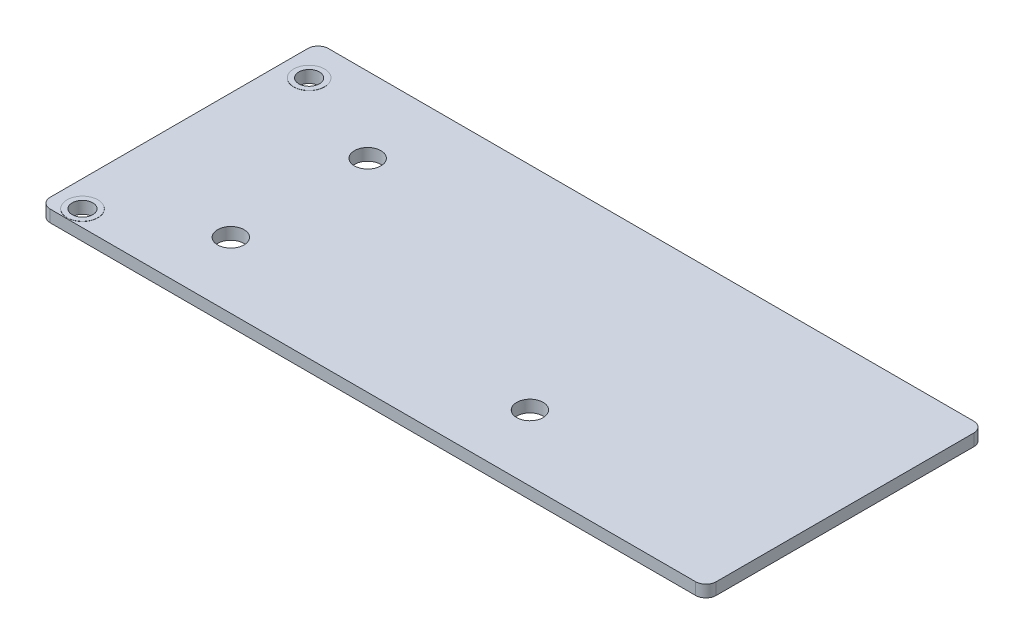
ISO-10303-21;
HEADER;
FILE_DESCRIPTION(('STEP AP214'),'2;1');
FILE_NAME('part.step','',(''),(''),'','','');
FILE_SCHEMA(('AUTOMOTIVE_DESIGN { 1 0 10303 214 1 1 1 1 }'));
ENDSEC;
DATA;
#1=APPLICATION_CONTEXT('core data for automotive mechanical design processes');
#2=APPLICATION_PROTOCOL_DEFINITION('international standard','automotive_design',2000,#1);
#3=PRODUCT_CONTEXT('',#1,'mechanical');
#4=PRODUCT('Part','Part','',(#3));
#5=PRODUCT_RELATED_PRODUCT_CATEGORY('part','',(#4));
#6=PRODUCT_DEFINITION_FORMATION('','',#4);
#7=PRODUCT_DEFINITION_CONTEXT('part definition',#1,'design');
#8=PRODUCT_DEFINITION('design','',#6,#7);
#9=PRODUCT_DEFINITION_SHAPE('','',#8);
#10=(LENGTH_UNIT() NAMED_UNIT(*) SI_UNIT(.MILLI.,.METRE.));
#11=(NAMED_UNIT(*) PLANE_ANGLE_UNIT() SI_UNIT($,.RADIAN.));
#12=(NAMED_UNIT(*) SI_UNIT($,.STERADIAN.) SOLID_ANGLE_UNIT());
#13=UNCERTAINTY_MEASURE_WITH_UNIT(LENGTH_MEASURE(1.E-05),#10,'distance_accuracy_value','');
#14=(GEOMETRIC_REPRESENTATION_CONTEXT(3) GLOBAL_UNCERTAINTY_ASSIGNED_CONTEXT((#13)) GLOBAL_UNIT_ASSIGNED_CONTEXT((#10,
#11,#12)) REPRESENTATION_CONTEXT('',''));
#15=CARTESIAN_POINT('',(0.,0.,0.));
#16=DIRECTION('',(0.,0.,1.));
#17=DIRECTION('',(1.,0.,0.));
#18=AXIS2_PLACEMENT_3D('',#15,#16,#17);
#19=CARTESIAN_POINT('',(32.325,1.16,13.5));
#20=DIRECTION('',(-1.,0.,0.));
#21=DIRECTION('',(0.,0.,1.));
#22=AXIS2_PLACEMENT_3D('',#19,#20,#21);
#23=PLANE('',#22);
#24=DIRECTION('',(0.,0.,-1.));
#25=VECTOR('',#24,1.);
#26=CARTESIAN_POINT('',(32.325,0.,13.5));
#27=LINE('',#26,#25);
#28=CARTESIAN_POINT('',(32.325,0.,12.5));
#29=VERTEX_POINT('',#28);
#30=CARTESIAN_POINT('',(32.325,0.,-12.5));
#31=VERTEX_POINT('',#30);
#32=EDGE_CURVE('E135',#29,#31,#27,.T.);
#33=ORIENTED_EDGE('',*,*,#32,.T.);
#34=DIRECTION('',(0.,-1.,0.));
#35=VECTOR('',#34,1.);
#36=CARTESIAN_POINT('',(32.325,1.16,-12.5));
#37=LINE('',#36,#35);
#38=CARTESIAN_POINT('',(32.325,1.16,-12.5));
#39=VERTEX_POINT('',#38);
#40=EDGE_CURVE('E158',#31,#39,#37,.F.);
#41=ORIENTED_EDGE('',*,*,#40,.T.);
#42=DIRECTION('',(0.,0.,-1.));
#43=VECTOR('',#42,1.);
#44=CARTESIAN_POINT('',(32.325,1.16,13.5));
#45=LINE('',#44,#43);
#46=CARTESIAN_POINT('',(32.325,1.16,12.5));
#47=VERTEX_POINT('',#46);
#48=EDGE_CURVE('E133',#47,#39,#45,.T.);
#49=ORIENTED_EDGE('',*,*,#48,.F.);
#50=DIRECTION('',(0.,-1.,0.));
#51=VECTOR('',#50,1.);
#52=CARTESIAN_POINT('',(32.325,1.16,12.5));
#53=LINE('',#52,#51);
#54=EDGE_CURVE('E155',#47,#29,#53,.T.);
#55=ORIENTED_EDGE('',*,*,#54,.T.);
#56=EDGE_LOOP('',(#33,#41,#49,#55));
#57=FACE_BOUND('',#56,.T.);
#58=ADVANCED_FACE('F38',(#57),#23,.F.);
#59=CARTESIAN_POINT('',(-32.325,1.16,-13.5));
#60=DIRECTION('',(0.,0.,1.));
#61=DIRECTION('',(1.,0.,0.));
#62=AXIS2_PLACEMENT_3D('',#59,#60,#61);
#63=PLANE('',#62);
#64=DIRECTION('',(-1.,0.,0.));
#65=VECTOR('',#64,1.);
#66=CARTESIAN_POINT('',(-32.325,0.,-13.5));
#67=LINE('',#66,#65);
#68=CARTESIAN_POINT('',(31.325,0.,-13.5));
#69=VERTEX_POINT('',#68);
#70=CARTESIAN_POINT('',(-31.325,0.,-13.5));
#71=VERTEX_POINT('',#70);
#72=EDGE_CURVE('E131',#69,#71,#67,.T.);
#73=ORIENTED_EDGE('',*,*,#72,.T.);
#74=DIRECTION('',(0.,-1.,0.));
#75=VECTOR('',#74,1.);
#76=CARTESIAN_POINT('',(-31.325,1.16,-13.5));
#77=LINE('',#76,#75);
#78=CARTESIAN_POINT('',(-31.325,1.16,-13.5));
#79=VERTEX_POINT('',#78);
#80=EDGE_CURVE('E110',#71,#79,#77,.F.);
#81=ORIENTED_EDGE('',*,*,#80,.T.);
#82=DIRECTION('',(-1.,0.,0.));
#83=VECTOR('',#82,1.);
#84=CARTESIAN_POINT('',(-32.325,1.16,-13.5));
#85=LINE('',#84,#83);
#86=CARTESIAN_POINT('',(31.325,1.16,-13.5));
#87=VERTEX_POINT('',#86);
#88=EDGE_CURVE('E197',#87,#79,#85,.T.);
#89=ORIENTED_EDGE('',*,*,#88,.F.);
#90=DIRECTION('',(0.,-1.,0.));
#91=VECTOR('',#90,1.);
#92=CARTESIAN_POINT('',(31.325,1.16,-13.5));
#93=LINE('',#92,#91);
#94=EDGE_CURVE('E115',#87,#69,#93,.T.);
#95=ORIENTED_EDGE('',*,*,#94,.T.);
#96=EDGE_LOOP('',(#73,#81,#89,#95));
#97=FACE_BOUND('',#96,.T.);
#98=ADVANCED_FACE('F216',(#97),#63,.F.);
#99=CARTESIAN_POINT('',(-32.325,1.16,13.5));
#100=DIRECTION('',(1.,0.,0.));
#101=DIRECTION('',(0.,0.,-1.));
#102=AXIS2_PLACEMENT_3D('',#99,#100,#101);
#103=PLANE('',#102);
#104=DIRECTION('',(0.,0.,1.));
#105=VECTOR('',#104,1.);
#106=CARTESIAN_POINT('',(-32.325,1.16,13.5));
#107=LINE('',#106,#105);
#108=CARTESIAN_POINT('',(-32.325,1.16,-12.5));
#109=VERTEX_POINT('',#108);
#110=CARTESIAN_POINT('',(-32.325,1.16,12.5));
#111=VERTEX_POINT('',#110);
#112=EDGE_CURVE('E124',#109,#111,#107,.T.);
#113=ORIENTED_EDGE('',*,*,#112,.F.);
#114=DIRECTION('',(0.,-1.,0.));
#115=VECTOR('',#114,1.);
#116=CARTESIAN_POINT('',(-32.325,1.16,-12.5));
#117=LINE('',#116,#115);
#118=CARTESIAN_POINT('',(-32.325,0.,-12.5));
#119=VERTEX_POINT('',#118);
#120=EDGE_CURVE('E109',#109,#119,#117,.T.);
#121=ORIENTED_EDGE('',*,*,#120,.T.);
#122=DIRECTION('',(0.,0.,1.));
#123=VECTOR('',#122,1.);
#124=CARTESIAN_POINT('',(-32.325,0.,13.5));
#125=LINE('',#124,#123);
#126=CARTESIAN_POINT('',(-32.325,0.,12.5));
#127=VERTEX_POINT('',#126);
#128=EDGE_CURVE('E122',#119,#127,#125,.T.);
#129=ORIENTED_EDGE('',*,*,#128,.T.);
#130=DIRECTION('',(0.,-1.,0.));
#131=VECTOR('',#130,1.);
#132=CARTESIAN_POINT('',(-32.325,1.16,12.5));
#133=LINE('',#132,#131);
#134=EDGE_CURVE('E126',#127,#111,#133,.F.);
#135=ORIENTED_EDGE('',*,*,#134,.T.);
#136=EDGE_LOOP('',(#113,#121,#129,#135));
#137=FACE_BOUND('',#136,.T.);
#138=ADVANCED_FACE('F121',(#137),#103,.F.);
#139=CARTESIAN_POINT('',(-32.325,1.16,13.5));
#140=DIRECTION('',(0.,0.,-1.));
#141=DIRECTION('',(-1.,0.,0.));
#142=AXIS2_PLACEMENT_3D('',#139,#140,#141);
#143=PLANE('',#142);
#144=DIRECTION('',(1.,0.,0.));
#145=VECTOR('',#144,1.);
#146=CARTESIAN_POINT('',(-32.325,0.,13.5));
#147=LINE('',#146,#145);
#148=CARTESIAN_POINT('',(-31.325,0.,13.5));
#149=VERTEX_POINT('',#148);
#150=CARTESIAN_POINT('',(31.325,0.,13.5));
#151=VERTEX_POINT('',#150);
#152=EDGE_CURVE('E130',#149,#151,#147,.T.);
#153=ORIENTED_EDGE('',*,*,#152,.T.);
#154=DIRECTION('',(0.,-1.,0.));
#155=VECTOR('',#154,1.);
#156=CARTESIAN_POINT('',(31.325,1.16,13.5));
#157=LINE('',#156,#155);
#158=CARTESIAN_POINT('',(31.325,1.16,13.5));
#159=VERTEX_POINT('',#158);
#160=EDGE_CURVE('E53',#151,#159,#157,.F.);
#161=ORIENTED_EDGE('',*,*,#160,.T.);
#162=DIRECTION('',(1.,0.,0.));
#163=VECTOR('',#162,1.);
#164=CARTESIAN_POINT('',(-32.325,1.16,13.5));
#165=LINE('',#164,#163);
#166=CARTESIAN_POINT('',(-31.325,1.16,13.5));
#167=VERTEX_POINT('',#166);
#168=EDGE_CURVE('E139',#167,#159,#165,.T.);
#169=ORIENTED_EDGE('',*,*,#168,.F.);
#170=DIRECTION('',(0.,-1.,0.));
#171=VECTOR('',#170,1.);
#172=CARTESIAN_POINT('',(-31.325,1.16,13.5));
#173=LINE('',#172,#171);
#174=EDGE_CURVE('E160',#167,#149,#173,.T.);
#175=ORIENTED_EDGE('',*,*,#174,.T.);
#176=EDGE_LOOP('',(#153,#161,#169,#175));
#177=FACE_BOUND('',#176,.T.);
#178=ADVANCED_FACE('F218',(#177),#143,.F.);
#179=CARTESIAN_POINT('',(0.,1.16,0.));
#180=DIRECTION('',(0.,-1.,0.));
#181=DIRECTION('',(0.,0.,-1.));
#182=AXIS2_PLACEMENT_3D('',#179,#180,#181);
#183=PLANE('',#182);
#184=CARTESIAN_POINT('',(-29.775,1.16,-10.08));
#185=DIRECTION('',(0.,-1.,0.));
#186=DIRECTION('',(0.,0.,-1.));
#187=AXIS2_PLACEMENT_3D('',#184,#185,#186);
#188=CIRCLE('',#187,1.5);
#189=CARTESIAN_POINT('',(-29.775,1.16,-11.58));
#190=VERTEX_POINT('',#189);
#191=EDGE_CURVE('E311',#190,#190,#188,.T.);
#192=ORIENTED_EDGE('',*,*,#191,.T.);
#193=EDGE_LOOP('',(#192));
#194=FACE_BOUND('',#193,.T.);
#195=CARTESIAN_POINT('',(-29.775,1.16,11.92));
#196=DIRECTION('',(0.,-1.,0.));
#197=DIRECTION('',(0.,0.,-1.));
#198=AXIS2_PLACEMENT_3D('',#195,#196,#197);
#199=CIRCLE('',#198,1.5);
#200=CARTESIAN_POINT('',(-29.775,1.16,10.42));
#201=VERTEX_POINT('',#200);
#202=EDGE_CURVE('E326',#201,#201,#199,.T.);
#203=ORIENTED_EDGE('',*,*,#202,.T.);
#204=EDGE_LOOP('',(#203));
#205=FACE_BOUND('',#204,.T.);
#206=CARTESIAN_POINT('',(8.845,1.16,7.105));
#207=DIRECTION('',(0.,1.,0.));
#208=DIRECTION('',(0.,0.,1.));
#209=AXIS2_PLACEMENT_3D('',#206,#207,#208);
#210=CIRCLE('',#209,1.285);
#211=CARTESIAN_POINT('',(8.845,1.16,8.39));
#212=VERTEX_POINT('',#211);
#213=EDGE_CURVE('E192',#212,#212,#210,.T.);
#214=ORIENTED_EDGE('',*,*,#213,.F.);
#215=EDGE_LOOP('',(#214));
#216=FACE_BOUND('',#215,.T.);
#217=CARTESIAN_POINT('',(-20.19,1.16,-6.18));
#218=DIRECTION('',(0.,1.,0.));
#219=DIRECTION('',(0.,0.,1.));
#220=AXIS2_PLACEMENT_3D('',#217,#218,#219);
#221=CIRCLE('',#220,1.285);
#222=CARTESIAN_POINT('',(-20.19,1.16,-4.895));
#223=VERTEX_POINT('',#222);
#224=EDGE_CURVE('E330',#223,#223,#221,.T.);
#225=ORIENTED_EDGE('',*,*,#224,.F.);
#226=EDGE_LOOP('',(#225));
#227=FACE_BOUND('',#226,.T.);
#228=CARTESIAN_POINT('',(-20.19,1.16,7.105));
#229=DIRECTION('',(0.,1.,0.));
#230=DIRECTION('',(0.,0.,1.));
#231=AXIS2_PLACEMENT_3D('',#228,#229,#230);
#232=CIRCLE('',#231,1.285);
#233=CARTESIAN_POINT('',(-20.19,1.16,8.39));
#234=VERTEX_POINT('',#233);
#235=EDGE_CURVE('E186',#234,#234,#232,.T.);
#236=ORIENTED_EDGE('',*,*,#235,.F.);
#237=EDGE_LOOP('',(#236));
#238=FACE_BOUND('',#237,.T.);
#239=ORIENTED_EDGE('',*,*,#88,.T.);
#240=CARTESIAN_POINT('',(-31.325,1.16,-12.5));
#241=DIRECTION('',(0.,-1.,0.));
#242=DIRECTION('',(0.,0.,-1.));
#243=AXIS2_PLACEMENT_3D('',#240,#241,#242);
#244=CIRCLE('',#243,1.);
#245=EDGE_CURVE('E153',#79,#109,#244,.F.);
#246=ORIENTED_EDGE('',*,*,#245,.T.);
#247=ORIENTED_EDGE('',*,*,#112,.T.);
#248=CARTESIAN_POINT('',(-31.325,1.16,12.5));
#249=DIRECTION('',(0.,-1.,0.));
#250=DIRECTION('',(0.,0.,-1.));
#251=AXIS2_PLACEMENT_3D('',#248,#249,#250);
#252=CIRCLE('',#251,1.);
#253=EDGE_CURVE('E60',#111,#167,#252,.F.);
#254=ORIENTED_EDGE('',*,*,#253,.T.);
#255=ORIENTED_EDGE('',*,*,#168,.T.);
#256=CARTESIAN_POINT('',(31.325,1.16,12.5));
#257=DIRECTION('',(0.,-1.,0.));
#258=DIRECTION('',(0.,0.,-1.));
#259=AXIS2_PLACEMENT_3D('',#256,#257,#258);
#260=CIRCLE('',#259,1.);
#261=EDGE_CURVE('E149',#159,#47,#260,.F.);
#262=ORIENTED_EDGE('',*,*,#261,.T.);
#263=ORIENTED_EDGE('',*,*,#48,.T.);
#264=CARTESIAN_POINT('',(31.325,1.16,-12.5));
#265=DIRECTION('',(0.,-1.,0.));
#266=DIRECTION('',(0.,0.,-1.));
#267=AXIS2_PLACEMENT_3D('',#264,#265,#266);
#268=CIRCLE('',#267,1.);
#269=EDGE_CURVE('E151',#39,#87,#268,.F.);
#270=ORIENTED_EDGE('',*,*,#269,.T.);
#271=EDGE_LOOP('',(#239,#246,#247,#254,#255,#262,#263,#270));
#272=FACE_BOUND('',#271,.T.);
#273=ADVANCED_FACE('F171',(#194,#205,#216,#227,#238,#272),#183,.F.);
#274=CARTESIAN_POINT('',(0.,0.,0.));
#275=DIRECTION('',(0.,-1.,0.));
#276=DIRECTION('',(0.,0.,-1.));
#277=AXIS2_PLACEMENT_3D('',#274,#275,#276);
#278=PLANE('',#277);
#279=CARTESIAN_POINT('',(-29.775,0.,-10.08));
#280=DIRECTION('',(0.,-1.,0.));
#281=DIRECTION('',(0.,0.,-1.));
#282=AXIS2_PLACEMENT_3D('',#279,#280,#281);
#283=CIRCLE('',#282,1.5);
#284=CARTESIAN_POINT('',(-29.775,0.,-11.58));
#285=VERTEX_POINT('',#284);
#286=EDGE_CURVE('E11',#285,#285,#283,.T.);
#287=ORIENTED_EDGE('',*,*,#286,.F.);
#288=EDGE_LOOP('',(#287));
#289=FACE_BOUND('',#288,.T.);
#290=CARTESIAN_POINT('',(-29.775,0.,11.92));
#291=DIRECTION('',(0.,-1.,0.));
#292=DIRECTION('',(0.,0.,-1.));
#293=AXIS2_PLACEMENT_3D('',#290,#291,#292);
#294=CIRCLE('',#293,1.5);
#295=CARTESIAN_POINT('',(-29.775,0.,10.42));
#296=VERTEX_POINT('',#295);
#297=EDGE_CURVE('E46',#296,#296,#294,.T.);
#298=ORIENTED_EDGE('',*,*,#297,.F.);
#299=EDGE_LOOP('',(#298));
#300=FACE_BOUND('',#299,.T.);
#301=CARTESIAN_POINT('',(8.845,0.,7.105));
#302=DIRECTION('',(0.,1.,0.));
#303=DIRECTION('',(0.,0.,1.));
#304=AXIS2_PLACEMENT_3D('',#301,#302,#303);
#305=CIRCLE('',#304,1.285);
#306=CARTESIAN_POINT('',(8.845,0.,8.39));
#307=VERTEX_POINT('',#306);
#308=EDGE_CURVE('E177',#307,#307,#305,.T.);
#309=ORIENTED_EDGE('',*,*,#308,.T.);
#310=EDGE_LOOP('',(#309));
#311=FACE_BOUND('',#310,.T.);
#312=CARTESIAN_POINT('',(-20.19,0.,-6.18));
#313=DIRECTION('',(0.,1.,0.));
#314=DIRECTION('',(0.,0.,1.));
#315=AXIS2_PLACEMENT_3D('',#312,#313,#314);
#316=CIRCLE('',#315,1.285);
#317=CARTESIAN_POINT('',(-20.19,0.,-4.895));
#318=VERTEX_POINT('',#317);
#319=EDGE_CURVE('E181',#318,#318,#316,.T.);
#320=ORIENTED_EDGE('',*,*,#319,.T.);
#321=EDGE_LOOP('',(#320));
#322=FACE_BOUND('',#321,.T.);
#323=CARTESIAN_POINT('',(-20.19,0.,7.105));
#324=DIRECTION('',(0.,1.,0.));
#325=DIRECTION('',(0.,0.,1.));
#326=AXIS2_PLACEMENT_3D('',#323,#324,#325);
#327=CIRCLE('',#326,1.285);
#328=CARTESIAN_POINT('',(-20.19,0.,8.39));
#329=VERTEX_POINT('',#328);
#330=EDGE_CURVE('E184',#329,#329,#327,.T.);
#331=ORIENTED_EDGE('',*,*,#330,.T.);
#332=EDGE_LOOP('',(#331));
#333=FACE_BOUND('',#332,.T.);
#334=ORIENTED_EDGE('',*,*,#128,.F.);
#335=CARTESIAN_POINT('',(-31.325,0.,-12.5));
#336=DIRECTION('',(0.,-1.,0.));
#337=DIRECTION('',(0.,0.,-1.));
#338=AXIS2_PLACEMENT_3D('',#335,#336,#337);
#339=CIRCLE('',#338,1.);
#340=EDGE_CURVE('E105',#119,#71,#339,.T.);
#341=ORIENTED_EDGE('',*,*,#340,.T.);
#342=ORIENTED_EDGE('',*,*,#72,.F.);
#343=CARTESIAN_POINT('',(31.325,0.,-12.5));
#344=DIRECTION('',(0.,-1.,0.));
#345=DIRECTION('',(0.,0.,-1.));
#346=AXIS2_PLACEMENT_3D('',#343,#344,#345);
#347=CIRCLE('',#346,1.);
#348=EDGE_CURVE('E116',#69,#31,#347,.T.);
#349=ORIENTED_EDGE('',*,*,#348,.T.);
#350=ORIENTED_EDGE('',*,*,#32,.F.);
#351=CARTESIAN_POINT('',(31.325,0.,12.5));
#352=DIRECTION('',(0.,-1.,0.));
#353=DIRECTION('',(0.,0.,-1.));
#354=AXIS2_PLACEMENT_3D('',#351,#352,#353);
#355=CIRCLE('',#354,1.);
#356=EDGE_CURVE('E142',#29,#151,#355,.T.);
#357=ORIENTED_EDGE('',*,*,#356,.T.);
#358=ORIENTED_EDGE('',*,*,#152,.F.);
#359=CARTESIAN_POINT('',(-31.325,0.,12.5));
#360=DIRECTION('',(0.,-1.,0.));
#361=DIRECTION('',(0.,0.,-1.));
#362=AXIS2_PLACEMENT_3D('',#359,#360,#361);
#363=CIRCLE('',#362,1.);
#364=EDGE_CURVE('E125',#149,#127,#363,.T.);
#365=ORIENTED_EDGE('',*,*,#364,.T.);
#366=EDGE_LOOP('',(#334,#341,#342,#349,#350,#357,#358,#365));
#367=FACE_BOUND('',#366,.T.);
#368=ADVANCED_FACE('F128',(#289,#300,#311,#322,#333,#367),#278,.T.);
#369=CARTESIAN_POINT('',(-31.325,1.16,-12.5));
#370=DIRECTION('',(0.,-1.,0.));
#371=DIRECTION('',(0.,0.,-1.));
#372=AXIS2_PLACEMENT_3D('',#369,#370,#371);
#373=CYLINDRICAL_SURFACE('',#372,1.);
#374=ORIENTED_EDGE('',*,*,#245,.F.);
#375=ORIENTED_EDGE('',*,*,#80,.F.);
#376=ORIENTED_EDGE('',*,*,#340,.F.);
#377=ORIENTED_EDGE('',*,*,#120,.F.);
#378=EDGE_LOOP('',(#374,#375,#376,#377));
#379=FACE_BOUND('',#378,.T.);
#380=ADVANCED_FACE('F108',(#379),#373,.T.);
#381=CARTESIAN_POINT('',(31.325,1.16,-12.5));
#382=DIRECTION('',(0.,-1.,0.));
#383=DIRECTION('',(0.,0.,-1.));
#384=AXIS2_PLACEMENT_3D('',#381,#382,#383);
#385=CYLINDRICAL_SURFACE('',#384,1.);
#386=ORIENTED_EDGE('',*,*,#269,.F.);
#387=ORIENTED_EDGE('',*,*,#40,.F.);
#388=ORIENTED_EDGE('',*,*,#348,.F.);
#389=ORIENTED_EDGE('',*,*,#94,.F.);
#390=EDGE_LOOP('',(#386,#387,#388,#389));
#391=FACE_BOUND('',#390,.T.);
#392=ADVANCED_FACE('F213',(#391),#385,.T.);
#393=CARTESIAN_POINT('',(31.325,1.16,12.5));
#394=DIRECTION('',(0.,-1.,0.));
#395=DIRECTION('',(0.,0.,-1.));
#396=AXIS2_PLACEMENT_3D('',#393,#394,#395);
#397=CYLINDRICAL_SURFACE('',#396,1.);
#398=ORIENTED_EDGE('',*,*,#261,.F.);
#399=ORIENTED_EDGE('',*,*,#160,.F.);
#400=ORIENTED_EDGE('',*,*,#356,.F.);
#401=ORIENTED_EDGE('',*,*,#54,.F.);
#402=EDGE_LOOP('',(#398,#399,#400,#401));
#403=FACE_BOUND('',#402,.T.);
#404=ADVANCED_FACE('F206',(#403),#397,.T.);
#405=CARTESIAN_POINT('',(-31.325,1.16,12.5));
#406=DIRECTION('',(0.,-1.,0.));
#407=DIRECTION('',(0.,0.,-1.));
#408=AXIS2_PLACEMENT_3D('',#405,#406,#407);
#409=CYLINDRICAL_SURFACE('',#408,1.);
#410=ORIENTED_EDGE('',*,*,#253,.F.);
#411=ORIENTED_EDGE('',*,*,#134,.F.);
#412=ORIENTED_EDGE('',*,*,#364,.F.);
#413=ORIENTED_EDGE('',*,*,#174,.F.);
#414=EDGE_LOOP('',(#410,#411,#412,#413));
#415=FACE_BOUND('',#414,.T.);
#416=ADVANCED_FACE('F40',(#415),#409,.T.);
#417=CARTESIAN_POINT('',(-20.19,0.,7.105));
#418=DIRECTION('',(0.,1.,0.));
#419=DIRECTION('',(0.,0.,1.));
#420=AXIS2_PLACEMENT_3D('',#417,#418,#419);
#421=CYLINDRICAL_SURFACE('',#420,1.285);
#422=ORIENTED_EDGE('',*,*,#330,.F.);
#423=EDGE_LOOP('',(#422));
#424=FACE_BOUND('',#423,.T.);
#425=ORIENTED_EDGE('',*,*,#235,.T.);
#426=EDGE_LOOP('',(#425));
#427=FACE_BOUND('',#426,.T.);
#428=ADVANCED_FACE('F242',(#424,#427),#421,.F.);
#429=CARTESIAN_POINT('',(-20.19,0.,-6.18));
#430=DIRECTION('',(0.,1.,0.));
#431=DIRECTION('',(0.,0.,1.));
#432=AXIS2_PLACEMENT_3D('',#429,#430,#431);
#433=CYLINDRICAL_SURFACE('',#432,1.285);
#434=ORIENTED_EDGE('',*,*,#319,.F.);
#435=EDGE_LOOP('',(#434));
#436=FACE_BOUND('',#435,.T.);
#437=ORIENTED_EDGE('',*,*,#224,.T.);
#438=EDGE_LOOP('',(#437));
#439=FACE_BOUND('',#438,.T.);
#440=ADVANCED_FACE('F246',(#436,#439),#433,.F.);
#441=CARTESIAN_POINT('',(8.845,0.,7.105));
#442=DIRECTION('',(0.,1.,0.));
#443=DIRECTION('',(0.,0.,1.));
#444=AXIS2_PLACEMENT_3D('',#441,#442,#443);
#445=CYLINDRICAL_SURFACE('',#444,1.285);
#446=ORIENTED_EDGE('',*,*,#308,.F.);
#447=EDGE_LOOP('',(#446));
#448=FACE_BOUND('',#447,.T.);
#449=ORIENTED_EDGE('',*,*,#213,.T.);
#450=EDGE_LOOP('',(#449));
#451=FACE_BOUND('',#450,.T.);
#452=ADVANCED_FACE('F251',(#448,#451),#445,.F.);
#453=CARTESIAN_POINT('',(-29.775,-0.0049999999999998,11.92));
#454=DIRECTION('',(0.,1.,0.));
#455=DIRECTION('',(0.,0.,1.));
#456=AXIS2_PLACEMENT_3D('',#453,#454,#455);
#457=CYLINDRICAL_SURFACE('',#456,1.5);
#458=ORIENTED_EDGE('',*,*,#297,.T.);
#459=EDGE_LOOP('',(#458));
#460=FACE_BOUND('',#459,.T.);
#461=CARTESIAN_POINT('',(-29.775,-0.0049999999999998,11.92));
#462=DIRECTION('',(0.,1.,0.));
#463=DIRECTION('',(0.,0.,1.));
#464=AXIS2_PLACEMENT_3D('',#461,#462,#463);
#465=CIRCLE('',#464,1.5);
#466=CARTESIAN_POINT('',(-29.775,-0.0049999999999998,13.42));
#467=VERTEX_POINT('',#466);
#468=EDGE_CURVE('E323',#467,#467,#465,.T.);
#469=ORIENTED_EDGE('',*,*,#468,.T.);
#470=EDGE_LOOP('',(#469));
#471=FACE_BOUND('',#470,.T.);
#472=ADVANCED_FACE('F166',(#460,#471),#457,.T.);
#473=CARTESIAN_POINT('',(-29.775,-0.0049999999999998,11.92));
#474=DIRECTION('',(0.,1.,0.));
#475=DIRECTION('',(0.,0.,1.));
#476=AXIS2_PLACEMENT_3D('',#473,#474,#475);
#477=PLANE('',#476);
#478=CARTESIAN_POINT('',(-29.775,-0.0049999999999998,11.92));
#479=DIRECTION('',(0.,1.,0.));
#480=DIRECTION('',(0.,0.,1.));
#481=AXIS2_PLACEMENT_3D('',#478,#479,#480);
#482=CIRCLE('',#481,1.);
#483=CARTESIAN_POINT('',(-29.775,-0.0049999999999998,12.92));
#484=VERTEX_POINT('',#483);
#485=EDGE_CURVE('E320',#484,#484,#482,.T.);
#486=ORIENTED_EDGE('',*,*,#485,.T.);
#487=EDGE_LOOP('',(#486));
#488=FACE_BOUND('',#487,.T.);
#489=ORIENTED_EDGE('',*,*,#468,.F.);
#490=EDGE_LOOP('',(#489));
#491=FACE_BOUND('',#490,.T.);
#492=ADVANCED_FACE('F269',(#488,#491),#477,.F.);
#493=CARTESIAN_POINT('',(-29.775,0.,11.92));
#494=DIRECTION('',(0.,1.,0.));
#495=DIRECTION('',(0.,0.,1.));
#496=AXIS2_PLACEMENT_3D('',#493,#494,#495);
#497=CYLINDRICAL_SURFACE('',#496,1.);
#498=ORIENTED_EDGE('',*,*,#485,.F.);
#499=EDGE_LOOP('',(#498));
#500=FACE_BOUND('',#499,.T.);
#501=CARTESIAN_POINT('',(-29.775,1.175,11.92));
#502=DIRECTION('',(0.,1.,0.));
#503=DIRECTION('',(0.,0.,1.));
#504=AXIS2_PLACEMENT_3D('',#501,#502,#503);
#505=CIRCLE('',#504,1.);
#506=CARTESIAN_POINT('',(-29.775,1.175,12.92));
#507=VERTEX_POINT('',#506);
#508=EDGE_CURVE('E314',#507,#507,#505,.T.);
#509=ORIENTED_EDGE('',*,*,#508,.T.);
#510=EDGE_LOOP('',(#509));
#511=FACE_BOUND('',#510,.T.);
#512=ADVANCED_FACE('F265',(#500,#511),#497,.F.);
#513=CARTESIAN_POINT('',(-29.775,1.175,11.92));
#514=DIRECTION('',(0.,1.,0.));
#515=DIRECTION('',(0.,0.,1.));
#516=AXIS2_PLACEMENT_3D('',#513,#514,#515);
#517=CIRCLE('',#516,1.5);
#518=CARTESIAN_POINT('',(-29.775,1.175,13.42));
#519=VERTEX_POINT('',#518);
#520=EDGE_CURVE('E317',#519,#519,#517,.T.);
#521=ORIENTED_EDGE('',*,*,#520,.F.);
#522=EDGE_LOOP('',(#521));
#523=FACE_BOUND('',#522,.T.);
#524=ORIENTED_EDGE('',*,*,#202,.F.);
#525=EDGE_LOOP('',(#524));
#526=FACE_BOUND('',#525,.T.);
#527=ADVANCED_FACE('F268',(#523,#526),#457,.T.);
#528=CARTESIAN_POINT('',(-29.775,1.175,11.92));
#529=DIRECTION('',(0.,1.,0.));
#530=DIRECTION('',(0.,0.,1.));
#531=AXIS2_PLACEMENT_3D('',#528,#529,#530);
#532=PLANE('',#531);
#533=ORIENTED_EDGE('',*,*,#520,.T.);
#534=EDGE_LOOP('',(#533));
#535=FACE_BOUND('',#534,.T.);
#536=ORIENTED_EDGE('',*,*,#508,.F.);
#537=EDGE_LOOP('',(#536));
#538=FACE_BOUND('',#537,.T.);
#539=ADVANCED_FACE('F276',(#535,#538),#532,.T.);
#540=CARTESIAN_POINT('',(-29.775,-0.0049999999999998,-10.08));
#541=DIRECTION('',(0.,1.,0.));
#542=DIRECTION('',(0.,0.,1.));
#543=AXIS2_PLACEMENT_3D('',#540,#541,#542);
#544=CYLINDRICAL_SURFACE('',#543,1.5);
#545=ORIENTED_EDGE('',*,*,#286,.T.);
#546=EDGE_LOOP('',(#545));
#547=FACE_BOUND('',#546,.T.);
#548=CARTESIAN_POINT('',(-29.775,-0.0049999999999998,-10.08));
#549=DIRECTION('',(0.,1.,0.));
#550=DIRECTION('',(0.,0.,1.));
#551=AXIS2_PLACEMENT_3D('',#548,#549,#550);
#552=CIRCLE('',#551,1.5);
#553=CARTESIAN_POINT('',(-29.775,-0.0049999999999998,-8.58));
#554=VERTEX_POINT('',#553);
#555=EDGE_CURVE('E308',#554,#554,#552,.T.);
#556=ORIENTED_EDGE('',*,*,#555,.T.);
#557=EDGE_LOOP('',(#556));
#558=FACE_BOUND('',#557,.T.);
#559=ADVANCED_FACE('F279',(#547,#558),#544,.T.);
#560=CARTESIAN_POINT('',(-29.775,-0.0049999999999998,-10.08));
#561=DIRECTION('',(0.,1.,0.));
#562=DIRECTION('',(0.,0.,1.));
#563=AXIS2_PLACEMENT_3D('',#560,#561,#562);
#564=PLANE('',#563);
#565=CARTESIAN_POINT('',(-29.775,-0.0049999999999998,-10.08));
#566=DIRECTION('',(0.,1.,0.));
#567=DIRECTION('',(0.,0.,1.));
#568=AXIS2_PLACEMENT_3D('',#565,#566,#567);
#569=CIRCLE('',#568,1.);
#570=CARTESIAN_POINT('',(-29.775,-0.0049999999999998,-9.08));
#571=VERTEX_POINT('',#570);
#572=EDGE_CURVE('E303',#571,#571,#569,.T.);
#573=ORIENTED_EDGE('',*,*,#572,.T.);
#574=EDGE_LOOP('',(#573));
#575=FACE_BOUND('',#574,.T.);
#576=ORIENTED_EDGE('',*,*,#555,.F.);
#577=EDGE_LOOP('',(#576));
#578=FACE_BOUND('',#577,.T.);
#579=ADVANCED_FACE('F260',(#575,#578),#564,.F.);
#580=CARTESIAN_POINT('',(-29.775,0.,-10.08));
#581=DIRECTION('',(0.,1.,0.));
#582=DIRECTION('',(0.,0.,1.));
#583=AXIS2_PLACEMENT_3D('',#580,#581,#582);
#584=CYLINDRICAL_SURFACE('',#583,1.);
#585=ORIENTED_EDGE('',*,*,#572,.F.);
#586=EDGE_LOOP('',(#585));
#587=FACE_BOUND('',#586,.T.);
#588=CARTESIAN_POINT('',(-29.775,1.175,-10.08));
#589=DIRECTION('',(0.,1.,0.));
#590=DIRECTION('',(0.,0.,1.));
#591=AXIS2_PLACEMENT_3D('',#588,#589,#590);
#592=CIRCLE('',#591,1.);
#593=CARTESIAN_POINT('',(-29.775,1.175,-9.08));
#594=VERTEX_POINT('',#593);
#595=EDGE_CURVE('E300',#594,#594,#592,.T.);
#596=ORIENTED_EDGE('',*,*,#595,.T.);
#597=EDGE_LOOP('',(#596));
#598=FACE_BOUND('',#597,.T.);
#599=ADVANCED_FACE('F256',(#587,#598),#584,.F.);
#600=CARTESIAN_POINT('',(-29.775,1.175,-10.08));
#601=DIRECTION('',(0.,1.,0.));
#602=DIRECTION('',(0.,0.,1.));
#603=AXIS2_PLACEMENT_3D('',#600,#601,#602);
#604=CIRCLE('',#603,1.5);
#605=CARTESIAN_POINT('',(-29.775,1.175,-8.58));
#606=VERTEX_POINT('',#605);
#607=EDGE_CURVE('E297',#606,#606,#604,.T.);
#608=ORIENTED_EDGE('',*,*,#607,.F.);
#609=EDGE_LOOP('',(#608));
#610=FACE_BOUND('',#609,.T.);
#611=ORIENTED_EDGE('',*,*,#191,.F.);
#612=EDGE_LOOP('',(#611));
#613=FACE_BOUND('',#612,.T.);
#614=ADVANCED_FACE('F259',(#610,#613),#544,.T.);
#615=CARTESIAN_POINT('',(-29.775,1.175,-10.08));
#616=DIRECTION('',(0.,1.,0.));
#617=DIRECTION('',(0.,0.,1.));
#618=AXIS2_PLACEMENT_3D('',#615,#616,#617);
#619=PLANE('',#618);
#620=ORIENTED_EDGE('',*,*,#607,.T.);
#621=EDGE_LOOP('',(#620));
#622=FACE_BOUND('',#621,.T.);
#623=ORIENTED_EDGE('',*,*,#595,.F.);
#624=EDGE_LOOP('',(#623));
#625=FACE_BOUND('',#624,.T.);
#626=ADVANCED_FACE('F287',(#622,#625),#619,.T.);
#627=CLOSED_SHELL('',(#58,#98,#138,#178,#273,#368,#380,#392,#404,#416,#428,#440,#452,#472,#492,
#512,#527,#539,#559,#579,#599,#614,#626));
#628=MANIFOLD_SOLID_BREP('B2',#627);
#629=ADVANCED_BREP_SHAPE_REPRESENTATION('',(#18,#628),#14);
#630=SHAPE_DEFINITION_REPRESENTATION(#9,#629);
ENDSEC;
END-ISO-10303-21;
